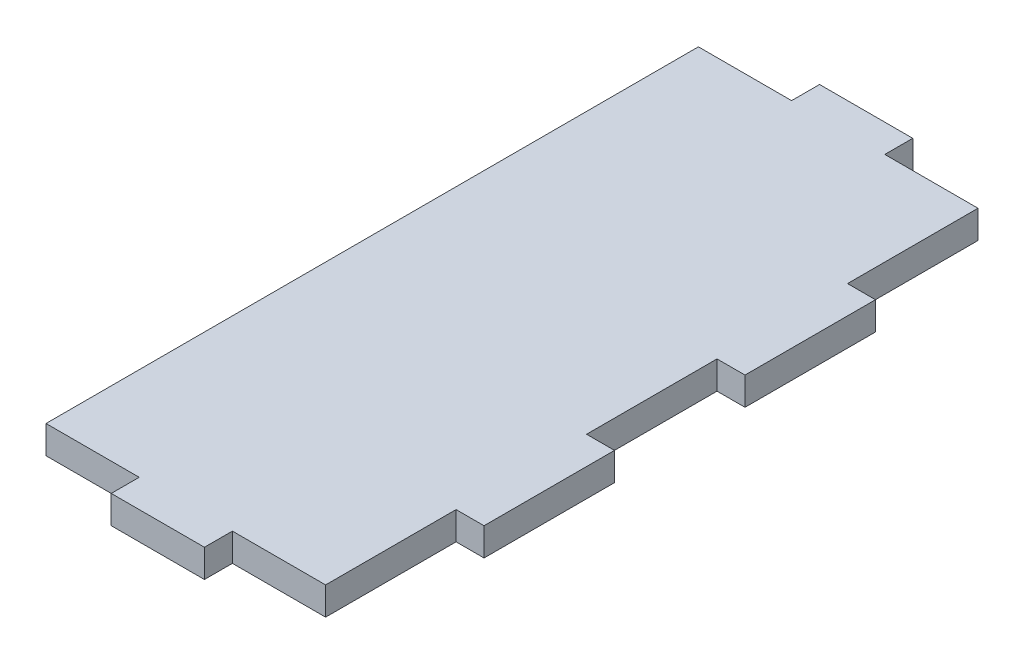
ISO-10303-21;
HEADER;
FILE_DESCRIPTION(('STEP AP214'),'2;1');
FILE_NAME('part.step','',(''),(''),'','','');
FILE_SCHEMA(('AUTOMOTIVE_DESIGN { 1 0 10303 214 1 1 1 1 }'));
ENDSEC;
DATA;
#1=APPLICATION_CONTEXT('core data for automotive mechanical design processes');
#2=APPLICATION_PROTOCOL_DEFINITION('international standard','automotive_design',2000,#1);
#3=PRODUCT_CONTEXT('',#1,'mechanical');
#4=PRODUCT('Part','Part','',(#3));
#5=PRODUCT_RELATED_PRODUCT_CATEGORY('part','',(#4));
#6=PRODUCT_DEFINITION_FORMATION('','',#4);
#7=PRODUCT_DEFINITION_CONTEXT('part definition',#1,'design');
#8=PRODUCT_DEFINITION('design','',#6,#7);
#9=PRODUCT_DEFINITION_SHAPE('','',#8);
#10=(LENGTH_UNIT() NAMED_UNIT(*) SI_UNIT(.MILLI.,.METRE.));
#11=(NAMED_UNIT(*) PLANE_ANGLE_UNIT() SI_UNIT($,.RADIAN.));
#12=(NAMED_UNIT(*) SI_UNIT($,.STERADIAN.) SOLID_ANGLE_UNIT());
#13=UNCERTAINTY_MEASURE_WITH_UNIT(LENGTH_MEASURE(1.E-05),#10,'distance_accuracy_value','');
#14=(GEOMETRIC_REPRESENTATION_CONTEXT(3) GLOBAL_UNCERTAINTY_ASSIGNED_CONTEXT((#13)) GLOBAL_UNIT_ASSIGNED_CONTEXT((#10,
#11,#12)) REPRESENTATION_CONTEXT('',''));
#15=CARTESIAN_POINT('',(0.,0.,0.));
#16=DIRECTION('',(0.,0.,1.));
#17=DIRECTION('',(1.,0.,0.));
#18=AXIS2_PLACEMENT_3D('',#15,#16,#17);
#19=CARTESIAN_POINT('',(0.,3.,70.));
#20=DIRECTION('',(1.,0.,0.));
#21=DIRECTION('',(0.,0.,-1.));
#22=AXIS2_PLACEMENT_3D('',#19,#20,#21);
#23=PLANE('',#22);
#24=DIRECTION('',(0.,0.,1.));
#25=VECTOR('',#24,1.);
#26=CARTESIAN_POINT('',(0.,0.,70.));
#27=LINE('',#26,#25);
#28=CARTESIAN_POINT('',(0.,0.,0.));
#29=VERTEX_POINT('',#28);
#30=CARTESIAN_POINT('',(0.,0.,70.));
#31=VERTEX_POINT('',#30);
#32=EDGE_CURVE('E201',#29,#31,#27,.T.);
#33=ORIENTED_EDGE('',*,*,#32,.T.);
#34=DIRECTION('',(0.,-1.,0.));
#35=VECTOR('',#34,1.);
#36=CARTESIAN_POINT('',(0.,3.,70.));
#37=LINE('',#36,#35);
#38=CARTESIAN_POINT('',(0.,3.,70.));
#39=VERTEX_POINT('',#38);
#40=EDGE_CURVE('E11',#39,#31,#37,.T.);
#41=ORIENTED_EDGE('',*,*,#40,.F.);
#42=DIRECTION('',(0.,0.,1.));
#43=VECTOR('',#42,1.);
#44=CARTESIAN_POINT('',(0.,3.,70.));
#45=LINE('',#44,#43);
#46=CARTESIAN_POINT('',(0.,3.,0.));
#47=VERTEX_POINT('',#46);
#48=EDGE_CURVE('E239',#47,#39,#45,.T.);
#49=ORIENTED_EDGE('',*,*,#48,.F.);
#50=DIRECTION('',(0.,-1.,0.));
#51=VECTOR('',#50,1.);
#52=CARTESIAN_POINT('',(0.,3.,0.));
#53=LINE('',#52,#51);
#54=EDGE_CURVE('E197',#47,#29,#53,.T.);
#55=ORIENTED_EDGE('',*,*,#54,.T.);
#56=EDGE_LOOP('',(#33,#41,#49,#55));
#57=FACE_BOUND('',#56,.T.);
#58=ADVANCED_FACE('F33',(#57),#23,.F.);
#59=CARTESIAN_POINT('',(10.,3.,70.));
#60=DIRECTION('',(0.,0.,-1.));
#61=DIRECTION('',(-1.,0.,0.));
#62=AXIS2_PLACEMENT_3D('',#59,#60,#61);
#63=PLANE('',#62);
#64=DIRECTION('',(1.,0.,0.));
#65=VECTOR('',#64,1.);
#66=CARTESIAN_POINT('',(10.,0.,70.));
#67=LINE('',#66,#65);
#68=CARTESIAN_POINT('',(10.,0.,70.));
#69=VERTEX_POINT('',#68);
#70=EDGE_CURVE('E204',#31,#69,#67,.T.);
#71=ORIENTED_EDGE('',*,*,#70,.T.);
#72=DIRECTION('',(0.,-1.,0.));
#73=VECTOR('',#72,1.);
#74=CARTESIAN_POINT('',(10.,3.,70.));
#75=LINE('',#74,#73);
#76=CARTESIAN_POINT('',(10.,3.,70.));
#77=VERTEX_POINT('',#76);
#78=EDGE_CURVE('E41',#77,#69,#75,.T.);
#79=ORIENTED_EDGE('',*,*,#78,.F.);
#80=DIRECTION('',(1.,0.,0.));
#81=VECTOR('',#80,1.);
#82=CARTESIAN_POINT('',(10.,3.,70.));
#83=LINE('',#82,#81);
#84=EDGE_CURVE('E128',#39,#77,#83,.T.);
#85=ORIENTED_EDGE('',*,*,#84,.F.);
#86=ORIENTED_EDGE('',*,*,#40,.T.);
#87=EDGE_LOOP('',(#71,#79,#85,#86));
#88=FACE_BOUND('',#87,.T.);
#89=ADVANCED_FACE('F357',(#88),#63,.F.);
#90=CARTESIAN_POINT('',(10.,3.,73.));
#91=DIRECTION('',(1.,0.,0.));
#92=DIRECTION('',(0.,0.,-1.));
#93=AXIS2_PLACEMENT_3D('',#90,#91,#92);
#94=PLANE('',#93);
#95=DIRECTION('',(0.,0.,1.));
#96=VECTOR('',#95,1.);
#97=CARTESIAN_POINT('',(10.,0.,73.));
#98=LINE('',#97,#96);
#99=CARTESIAN_POINT('',(10.,0.,73.));
#100=VERTEX_POINT('',#99);
#101=EDGE_CURVE('E206',#69,#100,#98,.T.);
#102=ORIENTED_EDGE('',*,*,#101,.T.);
#103=DIRECTION('',(0.,-1.,0.));
#104=VECTOR('',#103,1.);
#105=CARTESIAN_POINT('',(10.,3.,73.));
#106=LINE('',#105,#104);
#107=CARTESIAN_POINT('',(10.,3.,73.));
#108=VERTEX_POINT('',#107);
#109=EDGE_CURVE('E282',#108,#100,#106,.T.);
#110=ORIENTED_EDGE('',*,*,#109,.F.);
#111=DIRECTION('',(0.,0.,1.));
#112=VECTOR('',#111,1.);
#113=CARTESIAN_POINT('',(10.,3.,73.));
#114=LINE('',#113,#112);
#115=EDGE_CURVE('E290',#77,#108,#114,.T.);
#116=ORIENTED_EDGE('',*,*,#115,.F.);
#117=ORIENTED_EDGE('',*,*,#78,.T.);
#118=EDGE_LOOP('',(#102,#110,#116,#117));
#119=FACE_BOUND('',#118,.T.);
#120=ADVANCED_FACE('F288',(#119),#94,.F.);
#121=CARTESIAN_POINT('',(20.,3.,73.));
#122=DIRECTION('',(0.,0.,-1.));
#123=DIRECTION('',(-1.,0.,0.));
#124=AXIS2_PLACEMENT_3D('',#121,#122,#123);
#125=PLANE('',#124);
#126=DIRECTION('',(1.,0.,0.));
#127=VECTOR('',#126,1.);
#128=CARTESIAN_POINT('',(20.,0.,73.));
#129=LINE('',#128,#127);
#130=CARTESIAN_POINT('',(20.,0.,73.));
#131=VERTEX_POINT('',#130);
#132=EDGE_CURVE('E208',#100,#131,#129,.T.);
#133=ORIENTED_EDGE('',*,*,#132,.T.);
#134=DIRECTION('',(0.,-1.,0.));
#135=VECTOR('',#134,1.);
#136=CARTESIAN_POINT('',(20.,3.,73.));
#137=LINE('',#136,#135);
#138=CARTESIAN_POINT('',(20.,3.,73.));
#139=VERTEX_POINT('',#138);
#140=EDGE_CURVE('E279',#139,#131,#137,.T.);
#141=ORIENTED_EDGE('',*,*,#140,.F.);
#142=DIRECTION('',(1.,0.,0.));
#143=VECTOR('',#142,1.);
#144=CARTESIAN_POINT('',(20.,3.,73.));
#145=LINE('',#144,#143);
#146=EDGE_CURVE('E308',#108,#139,#145,.T.);
#147=ORIENTED_EDGE('',*,*,#146,.F.);
#148=ORIENTED_EDGE('',*,*,#109,.T.);
#149=EDGE_LOOP('',(#133,#141,#147,#148));
#150=FACE_BOUND('',#149,.T.);
#151=ADVANCED_FACE('F299',(#150),#125,.F.);
#152=CARTESIAN_POINT('',(20.,3.,70.));
#153=DIRECTION('',(-1.,0.,0.));
#154=DIRECTION('',(0.,0.,1.));
#155=AXIS2_PLACEMENT_3D('',#152,#153,#154);
#156=PLANE('',#155);
#157=DIRECTION('',(0.,0.,-1.));
#158=VECTOR('',#157,1.);
#159=CARTESIAN_POINT('',(20.,0.,70.));
#160=LINE('',#159,#158);
#161=CARTESIAN_POINT('',(20.,0.,70.));
#162=VERTEX_POINT('',#161);
#163=EDGE_CURVE('E210',#131,#162,#160,.T.);
#164=ORIENTED_EDGE('',*,*,#163,.T.);
#165=DIRECTION('',(0.,-1.,0.));
#166=VECTOR('',#165,1.);
#167=CARTESIAN_POINT('',(20.,3.,70.));
#168=LINE('',#167,#166);
#169=CARTESIAN_POINT('',(20.,3.,70.));
#170=VERTEX_POINT('',#169);
#171=EDGE_CURVE('E276',#170,#162,#168,.T.);
#172=ORIENTED_EDGE('',*,*,#171,.F.);
#173=DIRECTION('',(0.,0.,-1.));
#174=VECTOR('',#173,1.);
#175=CARTESIAN_POINT('',(20.,3.,70.));
#176=LINE('',#175,#174);
#177=EDGE_CURVE('E305',#139,#170,#176,.T.);
#178=ORIENTED_EDGE('',*,*,#177,.F.);
#179=ORIENTED_EDGE('',*,*,#140,.T.);
#180=EDGE_LOOP('',(#164,#172,#178,#179));
#181=FACE_BOUND('',#180,.T.);
#182=ADVANCED_FACE('F303',(#181),#156,.F.);
#183=CARTESIAN_POINT('',(30.,3.,70.));
#184=DIRECTION('',(0.,0.,-1.));
#185=DIRECTION('',(-1.,0.,0.));
#186=AXIS2_PLACEMENT_3D('',#183,#184,#185);
#187=PLANE('',#186);
#188=DIRECTION('',(1.,0.,0.));
#189=VECTOR('',#188,1.);
#190=CARTESIAN_POINT('',(30.,0.,70.));
#191=LINE('',#190,#189);
#192=CARTESIAN_POINT('',(30.,0.,70.));
#193=VERTEX_POINT('',#192);
#194=EDGE_CURVE('E212',#162,#193,#191,.T.);
#195=ORIENTED_EDGE('',*,*,#194,.T.);
#196=DIRECTION('',(0.,-1.,0.));
#197=VECTOR('',#196,1.);
#198=CARTESIAN_POINT('',(30.,3.,70.));
#199=LINE('',#198,#197);
#200=CARTESIAN_POINT('',(30.,3.,70.));
#201=VERTEX_POINT('',#200);
#202=EDGE_CURVE('E273',#201,#193,#199,.T.);
#203=ORIENTED_EDGE('',*,*,#202,.F.);
#204=DIRECTION('',(1.,0.,0.));
#205=VECTOR('',#204,1.);
#206=CARTESIAN_POINT('',(30.,3.,70.));
#207=LINE('',#206,#205);
#208=EDGE_CURVE('E307',#170,#201,#207,.T.);
#209=ORIENTED_EDGE('',*,*,#208,.F.);
#210=ORIENTED_EDGE('',*,*,#171,.T.);
#211=EDGE_LOOP('',(#195,#203,#209,#210));
#212=FACE_BOUND('',#211,.T.);
#213=ADVANCED_FACE('F370',(#212),#187,.F.);
#214=CARTESIAN_POINT('',(30.,3.,70.));
#215=DIRECTION('',(-1.,0.,0.));
#216=DIRECTION('',(0.,0.,1.));
#217=AXIS2_PLACEMENT_3D('',#214,#215,#216);
#218=PLANE('',#217);
#219=DIRECTION('',(0.,0.,-1.));
#220=VECTOR('',#219,1.);
#221=CARTESIAN_POINT('',(30.,0.,70.));
#222=LINE('',#221,#220);
#223=CARTESIAN_POINT('',(30.,0.,56.));
#224=VERTEX_POINT('',#223);
#225=EDGE_CURVE('E214',#193,#224,#222,.T.);
#226=ORIENTED_EDGE('',*,*,#225,.T.);
#227=DIRECTION('',(0.,-1.,0.));
#228=VECTOR('',#227,1.);
#229=CARTESIAN_POINT('',(30.,3.,56.));
#230=LINE('',#229,#228);
#231=CARTESIAN_POINT('',(30.,3.,56.));
#232=VERTEX_POINT('',#231);
#233=EDGE_CURVE('E270',#232,#224,#230,.T.);
#234=ORIENTED_EDGE('',*,*,#233,.F.);
#235=DIRECTION('',(0.,0.,-1.));
#236=VECTOR('',#235,1.);
#237=CARTESIAN_POINT('',(30.,3.,70.));
#238=LINE('',#237,#236);
#239=EDGE_CURVE('E310',#201,#232,#238,.T.);
#240=ORIENTED_EDGE('',*,*,#239,.F.);
#241=ORIENTED_EDGE('',*,*,#202,.T.);
#242=EDGE_LOOP('',(#226,#234,#240,#241));
#243=FACE_BOUND('',#242,.T.);
#244=ADVANCED_FACE('F373',(#243),#218,.F.);
#245=CARTESIAN_POINT('',(30.,3.,56.));
#246=DIRECTION('',(0.,0.,-1.));
#247=DIRECTION('',(-1.,0.,0.));
#248=AXIS2_PLACEMENT_3D('',#245,#246,#247);
#249=PLANE('',#248);
#250=DIRECTION('',(1.,0.,0.));
#251=VECTOR('',#250,1.);
#252=CARTESIAN_POINT('',(30.,0.,56.));
#253=LINE('',#252,#251);
#254=CARTESIAN_POINT('',(33.,0.,56.));
#255=VERTEX_POINT('',#254);
#256=EDGE_CURVE('E216',#224,#255,#253,.T.);
#257=ORIENTED_EDGE('',*,*,#256,.T.);
#258=DIRECTION('',(0.,-1.,0.));
#259=VECTOR('',#258,1.);
#260=CARTESIAN_POINT('',(33.,3.,56.));
#261=LINE('',#260,#259);
#262=CARTESIAN_POINT('',(33.,3.,56.));
#263=VERTEX_POINT('',#262);
#264=EDGE_CURVE('E267',#263,#255,#261,.T.);
#265=ORIENTED_EDGE('',*,*,#264,.F.);
#266=DIRECTION('',(1.,0.,0.));
#267=VECTOR('',#266,1.);
#268=CARTESIAN_POINT('',(30.,3.,56.));
#269=LINE('',#268,#267);
#270=EDGE_CURVE('E316',#232,#263,#269,.T.);
#271=ORIENTED_EDGE('',*,*,#270,.F.);
#272=ORIENTED_EDGE('',*,*,#233,.T.);
#273=EDGE_LOOP('',(#257,#265,#271,#272));
#274=FACE_BOUND('',#273,.T.);
#275=ADVANCED_FACE('F377',(#274),#249,.F.);
#276=CARTESIAN_POINT('',(33.,3.,56.));
#277=DIRECTION('',(-1.,0.,0.));
#278=DIRECTION('',(0.,0.,1.));
#279=AXIS2_PLACEMENT_3D('',#276,#277,#278);
#280=PLANE('',#279);
#281=DIRECTION('',(0.,0.,-1.));
#282=VECTOR('',#281,1.);
#283=CARTESIAN_POINT('',(33.,0.,56.));
#284=LINE('',#283,#282);
#285=CARTESIAN_POINT('',(33.,0.,42.));
#286=VERTEX_POINT('',#285);
#287=EDGE_CURVE('E218',#255,#286,#284,.T.);
#288=ORIENTED_EDGE('',*,*,#287,.T.);
#289=DIRECTION('',(0.,-1.,0.));
#290=VECTOR('',#289,1.);
#291=CARTESIAN_POINT('',(33.,3.,42.));
#292=LINE('',#291,#290);
#293=CARTESIAN_POINT('',(33.,3.,42.));
#294=VERTEX_POINT('',#293);
#295=EDGE_CURVE('E264',#294,#286,#292,.T.);
#296=ORIENTED_EDGE('',*,*,#295,.F.);
#297=DIRECTION('',(0.,0.,-1.));
#298=VECTOR('',#297,1.);
#299=CARTESIAN_POINT('',(33.,3.,56.));
#300=LINE('',#299,#298);
#301=EDGE_CURVE('E318',#263,#294,#300,.T.);
#302=ORIENTED_EDGE('',*,*,#301,.F.);
#303=ORIENTED_EDGE('',*,*,#264,.T.);
#304=EDGE_LOOP('',(#288,#296,#302,#303));
#305=FACE_BOUND('',#304,.T.);
#306=ADVANCED_FACE('F381',(#305),#280,.F.);
#307=CARTESIAN_POINT('',(33.,3.,42.));
#308=DIRECTION('',(0.,0.,1.));
#309=DIRECTION('',(1.,0.,0.));
#310=AXIS2_PLACEMENT_3D('',#307,#308,#309);
#311=PLANE('',#310);
#312=DIRECTION('',(-1.,0.,0.));
#313=VECTOR('',#312,1.);
#314=CARTESIAN_POINT('',(33.,0.,42.));
#315=LINE('',#314,#313);
#316=CARTESIAN_POINT('',(30.,0.,42.));
#317=VERTEX_POINT('',#316);
#318=EDGE_CURVE('E220',#286,#317,#315,.T.);
#319=ORIENTED_EDGE('',*,*,#318,.T.);
#320=DIRECTION('',(0.,-1.,0.));
#321=VECTOR('',#320,1.);
#322=CARTESIAN_POINT('',(30.,3.,42.));
#323=LINE('',#322,#321);
#324=CARTESIAN_POINT('',(30.,3.,42.));
#325=VERTEX_POINT('',#324);
#326=EDGE_CURVE('E261',#325,#317,#323,.T.);
#327=ORIENTED_EDGE('',*,*,#326,.F.);
#328=DIRECTION('',(-1.,0.,0.));
#329=VECTOR('',#328,1.);
#330=CARTESIAN_POINT('',(33.,3.,42.));
#331=LINE('',#330,#329);
#332=EDGE_CURVE('E320',#294,#325,#331,.T.);
#333=ORIENTED_EDGE('',*,*,#332,.F.);
#334=ORIENTED_EDGE('',*,*,#295,.T.);
#335=EDGE_LOOP('',(#319,#327,#333,#334));
#336=FACE_BOUND('',#335,.T.);
#337=ADVANCED_FACE('F385',(#336),#311,.F.);
#338=CARTESIAN_POINT('',(30.,3.,42.));
#339=DIRECTION('',(-1.,0.,0.));
#340=DIRECTION('',(0.,0.,1.));
#341=AXIS2_PLACEMENT_3D('',#338,#339,#340);
#342=PLANE('',#341);
#343=DIRECTION('',(0.,0.,-1.));
#344=VECTOR('',#343,1.);
#345=CARTESIAN_POINT('',(30.,0.,42.));
#346=LINE('',#345,#344);
#347=CARTESIAN_POINT('',(30.,0.,28.));
#348=VERTEX_POINT('',#347);
#349=EDGE_CURVE('E222',#317,#348,#346,.T.);
#350=ORIENTED_EDGE('',*,*,#349,.T.);
#351=DIRECTION('',(0.,-1.,0.));
#352=VECTOR('',#351,1.);
#353=CARTESIAN_POINT('',(30.,3.,28.));
#354=LINE('',#353,#352);
#355=CARTESIAN_POINT('',(30.,3.,28.));
#356=VERTEX_POINT('',#355);
#357=EDGE_CURVE('E258',#356,#348,#354,.T.);
#358=ORIENTED_EDGE('',*,*,#357,.F.);
#359=DIRECTION('',(0.,0.,-1.));
#360=VECTOR('',#359,1.);
#361=CARTESIAN_POINT('',(30.,3.,42.));
#362=LINE('',#361,#360);
#363=EDGE_CURVE('E322',#325,#356,#362,.T.);
#364=ORIENTED_EDGE('',*,*,#363,.F.);
#365=ORIENTED_EDGE('',*,*,#326,.T.);
#366=EDGE_LOOP('',(#350,#358,#364,#365));
#367=FACE_BOUND('',#366,.T.);
#368=ADVANCED_FACE('F389',(#367),#342,.F.);
#369=CARTESIAN_POINT('',(30.,3.,28.));
#370=DIRECTION('',(0.,0.,-1.));
#371=DIRECTION('',(-1.,0.,0.));
#372=AXIS2_PLACEMENT_3D('',#369,#370,#371);
#373=PLANE('',#372);
#374=DIRECTION('',(1.,0.,0.));
#375=VECTOR('',#374,1.);
#376=CARTESIAN_POINT('',(30.,0.,28.));
#377=LINE('',#376,#375);
#378=CARTESIAN_POINT('',(33.,0.,28.));
#379=VERTEX_POINT('',#378);
#380=EDGE_CURVE('E224',#348,#379,#377,.T.);
#381=ORIENTED_EDGE('',*,*,#380,.T.);
#382=DIRECTION('',(0.,-1.,0.));
#383=VECTOR('',#382,1.);
#384=CARTESIAN_POINT('',(33.,3.,28.));
#385=LINE('',#384,#383);
#386=CARTESIAN_POINT('',(33.,3.,28.));
#387=VERTEX_POINT('',#386);
#388=EDGE_CURVE('E255',#387,#379,#385,.T.);
#389=ORIENTED_EDGE('',*,*,#388,.F.);
#390=DIRECTION('',(1.,0.,0.));
#391=VECTOR('',#390,1.);
#392=CARTESIAN_POINT('',(30.,3.,28.));
#393=LINE('',#392,#391);
#394=EDGE_CURVE('E324',#356,#387,#393,.T.);
#395=ORIENTED_EDGE('',*,*,#394,.F.);
#396=ORIENTED_EDGE('',*,*,#357,.T.);
#397=EDGE_LOOP('',(#381,#389,#395,#396));
#398=FACE_BOUND('',#397,.T.);
#399=ADVANCED_FACE('F393',(#398),#373,.F.);
#400=CARTESIAN_POINT('',(33.,3.,28.));
#401=DIRECTION('',(-1.,0.,0.));
#402=DIRECTION('',(0.,0.,1.));
#403=AXIS2_PLACEMENT_3D('',#400,#401,#402);
#404=PLANE('',#403);
#405=DIRECTION('',(0.,0.,-1.));
#406=VECTOR('',#405,1.);
#407=CARTESIAN_POINT('',(33.,0.,28.));
#408=LINE('',#407,#406);
#409=CARTESIAN_POINT('',(33.,0.,14.));
#410=VERTEX_POINT('',#409);
#411=EDGE_CURVE('E226',#379,#410,#408,.T.);
#412=ORIENTED_EDGE('',*,*,#411,.T.);
#413=DIRECTION('',(0.,-1.,0.));
#414=VECTOR('',#413,1.);
#415=CARTESIAN_POINT('',(33.,3.,14.));
#416=LINE('',#415,#414);
#417=CARTESIAN_POINT('',(33.,3.,14.));
#418=VERTEX_POINT('',#417);
#419=EDGE_CURVE('E252',#418,#410,#416,.T.);
#420=ORIENTED_EDGE('',*,*,#419,.F.);
#421=DIRECTION('',(0.,0.,-1.));
#422=VECTOR('',#421,1.);
#423=CARTESIAN_POINT('',(33.,3.,28.));
#424=LINE('',#423,#422);
#425=EDGE_CURVE('E326',#387,#418,#424,.T.);
#426=ORIENTED_EDGE('',*,*,#425,.F.);
#427=ORIENTED_EDGE('',*,*,#388,.T.);
#428=EDGE_LOOP('',(#412,#420,#426,#427));
#429=FACE_BOUND('',#428,.T.);
#430=ADVANCED_FACE('F397',(#429),#404,.F.);
#431=CARTESIAN_POINT('',(33.,3.,14.));
#432=DIRECTION('',(0.,0.,1.));
#433=DIRECTION('',(1.,0.,0.));
#434=AXIS2_PLACEMENT_3D('',#431,#432,#433);
#435=PLANE('',#434);
#436=DIRECTION('',(-1.,0.,0.));
#437=VECTOR('',#436,1.);
#438=CARTESIAN_POINT('',(33.,0.,14.));
#439=LINE('',#438,#437);
#440=CARTESIAN_POINT('',(30.,0.,14.));
#441=VERTEX_POINT('',#440);
#442=EDGE_CURVE('E228',#410,#441,#439,.T.);
#443=ORIENTED_EDGE('',*,*,#442,.T.);
#444=DIRECTION('',(0.,-1.,0.));
#445=VECTOR('',#444,1.);
#446=CARTESIAN_POINT('',(30.,3.,14.));
#447=LINE('',#446,#445);
#448=CARTESIAN_POINT('',(30.,3.,14.));
#449=VERTEX_POINT('',#448);
#450=EDGE_CURVE('E249',#449,#441,#447,.T.);
#451=ORIENTED_EDGE('',*,*,#450,.F.);
#452=DIRECTION('',(-1.,0.,0.));
#453=VECTOR('',#452,1.);
#454=CARTESIAN_POINT('',(33.,3.,14.));
#455=LINE('',#454,#453);
#456=EDGE_CURVE('E328',#418,#449,#455,.T.);
#457=ORIENTED_EDGE('',*,*,#456,.F.);
#458=ORIENTED_EDGE('',*,*,#419,.T.);
#459=EDGE_LOOP('',(#443,#451,#457,#458));
#460=FACE_BOUND('',#459,.T.);
#461=ADVANCED_FACE('F401',(#460),#435,.F.);
#462=CARTESIAN_POINT('',(30.,3.,14.));
#463=DIRECTION('',(-1.,0.,0.));
#464=DIRECTION('',(0.,0.,1.));
#465=AXIS2_PLACEMENT_3D('',#462,#463,#464);
#466=PLANE('',#465);
#467=DIRECTION('',(0.,0.,-1.));
#468=VECTOR('',#467,1.);
#469=CARTESIAN_POINT('',(30.,0.,14.));
#470=LINE('',#469,#468);
#471=CARTESIAN_POINT('',(30.,0.,0.));
#472=VERTEX_POINT('',#471);
#473=EDGE_CURVE('E230',#441,#472,#470,.T.);
#474=ORIENTED_EDGE('',*,*,#473,.T.);
#475=DIRECTION('',(0.,-1.,0.));
#476=VECTOR('',#475,1.);
#477=CARTESIAN_POINT('',(30.,3.,0.));
#478=LINE('',#477,#476);
#479=CARTESIAN_POINT('',(30.,3.,0.));
#480=VERTEX_POINT('',#479);
#481=EDGE_CURVE('E246',#480,#472,#478,.T.);
#482=ORIENTED_EDGE('',*,*,#481,.F.);
#483=DIRECTION('',(0.,0.,-1.));
#484=VECTOR('',#483,1.);
#485=CARTESIAN_POINT('',(30.,3.,14.));
#486=LINE('',#485,#484);
#487=EDGE_CURVE('E330',#449,#480,#486,.T.);
#488=ORIENTED_EDGE('',*,*,#487,.F.);
#489=ORIENTED_EDGE('',*,*,#450,.T.);
#490=EDGE_LOOP('',(#474,#482,#488,#489));
#491=FACE_BOUND('',#490,.T.);
#492=ADVANCED_FACE('F405',(#491),#466,.F.);
#493=CARTESIAN_POINT('',(20.,3.,0.));
#494=DIRECTION('',(0.,0.,1.));
#495=DIRECTION('',(1.,0.,0.));
#496=AXIS2_PLACEMENT_3D('',#493,#494,#495);
#497=PLANE('',#496);
#498=DIRECTION('',(-1.,0.,0.));
#499=VECTOR('',#498,1.);
#500=CARTESIAN_POINT('',(20.,0.,0.));
#501=LINE('',#500,#499);
#502=CARTESIAN_POINT('',(20.,0.,0.));
#503=VERTEX_POINT('',#502);
#504=EDGE_CURVE('E232',#472,#503,#501,.T.);
#505=ORIENTED_EDGE('',*,*,#504,.T.);
#506=DIRECTION('',(0.,-1.,0.));
#507=VECTOR('',#506,1.);
#508=CARTESIAN_POINT('',(20.,3.,0.));
#509=LINE('',#508,#507);
#510=CARTESIAN_POINT('',(20.,3.,0.));
#511=VERTEX_POINT('',#510);
#512=EDGE_CURVE('E243',#511,#503,#509,.T.);
#513=ORIENTED_EDGE('',*,*,#512,.F.);
#514=DIRECTION('',(-1.,0.,0.));
#515=VECTOR('',#514,1.);
#516=CARTESIAN_POINT('',(20.,3.,0.));
#517=LINE('',#516,#515);
#518=EDGE_CURVE('E332',#480,#511,#517,.T.);
#519=ORIENTED_EDGE('',*,*,#518,.F.);
#520=ORIENTED_EDGE('',*,*,#481,.T.);
#521=EDGE_LOOP('',(#505,#513,#519,#520));
#522=FACE_BOUND('',#521,.T.);
#523=ADVANCED_FACE('F338',(#522),#497,.F.);
#524=CARTESIAN_POINT('',(20.,3.,-3.));
#525=DIRECTION('',(-1.,0.,0.));
#526=DIRECTION('',(0.,0.,1.));
#527=AXIS2_PLACEMENT_3D('',#524,#525,#526);
#528=PLANE('',#527);
#529=DIRECTION('',(0.,0.,-1.));
#530=VECTOR('',#529,1.);
#531=CARTESIAN_POINT('',(20.,0.,-3.));
#532=LINE('',#531,#530);
#533=CARTESIAN_POINT('',(20.,0.,-3.));
#534=VERTEX_POINT('',#533);
#535=EDGE_CURVE('E234',#503,#534,#532,.T.);
#536=ORIENTED_EDGE('',*,*,#535,.T.);
#537=DIRECTION('',(0.,-1.,0.));
#538=VECTOR('',#537,1.);
#539=CARTESIAN_POINT('',(20.,3.,-3.));
#540=LINE('',#539,#538);
#541=CARTESIAN_POINT('',(20.,3.,-3.));
#542=VERTEX_POINT('',#541);
#543=EDGE_CURVE('E192',#542,#534,#540,.T.);
#544=ORIENTED_EDGE('',*,*,#543,.F.);
#545=DIRECTION('',(0.,0.,-1.));
#546=VECTOR('',#545,1.);
#547=CARTESIAN_POINT('',(20.,3.,-3.));
#548=LINE('',#547,#546);
#549=EDGE_CURVE('E183',#511,#542,#548,.T.);
#550=ORIENTED_EDGE('',*,*,#549,.F.);
#551=ORIENTED_EDGE('',*,*,#512,.T.);
#552=EDGE_LOOP('',(#536,#544,#550,#551));
#553=FACE_BOUND('',#552,.T.);
#554=ADVANCED_FACE('F342',(#553),#528,.F.);
#555=CARTESIAN_POINT('',(10.,3.,-3.));
#556=DIRECTION('',(0.,0.,1.));
#557=DIRECTION('',(1.,0.,0.));
#558=AXIS2_PLACEMENT_3D('',#555,#556,#557);
#559=PLANE('',#558);
#560=DIRECTION('',(-1.,0.,0.));
#561=VECTOR('',#560,1.);
#562=CARTESIAN_POINT('',(10.,0.,-3.));
#563=LINE('',#562,#561);
#564=CARTESIAN_POINT('',(10.,0.,-3.));
#565=VERTEX_POINT('',#564);
#566=EDGE_CURVE('E191',#534,#565,#563,.T.);
#567=ORIENTED_EDGE('',*,*,#566,.T.);
#568=DIRECTION('',(0.,-1.,0.));
#569=VECTOR('',#568,1.);
#570=CARTESIAN_POINT('',(10.,3.,-3.));
#571=LINE('',#570,#569);
#572=CARTESIAN_POINT('',(10.,3.,-3.));
#573=VERTEX_POINT('',#572);
#574=EDGE_CURVE('E188',#573,#565,#571,.T.);
#575=ORIENTED_EDGE('',*,*,#574,.F.);
#576=DIRECTION('',(-1.,0.,0.));
#577=VECTOR('',#576,1.);
#578=CARTESIAN_POINT('',(10.,3.,-3.));
#579=LINE('',#578,#577);
#580=EDGE_CURVE('E177',#542,#573,#579,.T.);
#581=ORIENTED_EDGE('',*,*,#580,.F.);
#582=ORIENTED_EDGE('',*,*,#543,.T.);
#583=EDGE_LOOP('',(#567,#575,#581,#582));
#584=FACE_BOUND('',#583,.T.);
#585=ADVANCED_FACE('F189',(#584),#559,.F.);
#586=CARTESIAN_POINT('',(10.,3.,0.));
#587=DIRECTION('',(1.,0.,0.));
#588=DIRECTION('',(0.,0.,-1.));
#589=AXIS2_PLACEMENT_3D('',#586,#587,#588);
#590=PLANE('',#589);
#591=DIRECTION('',(0.,0.,1.));
#592=VECTOR('',#591,1.);
#593=CARTESIAN_POINT('',(10.,0.,0.));
#594=LINE('',#593,#592);
#595=CARTESIAN_POINT('',(10.,0.,0.));
#596=VERTEX_POINT('',#595);
#597=EDGE_CURVE('E114',#565,#596,#594,.T.);
#598=ORIENTED_EDGE('',*,*,#597,.T.);
#599=DIRECTION('',(0.,-1.,0.));
#600=VECTOR('',#599,1.);
#601=CARTESIAN_POINT('',(10.,3.,0.));
#602=LINE('',#601,#600);
#603=CARTESIAN_POINT('',(10.,3.,0.));
#604=VERTEX_POINT('',#603);
#605=EDGE_CURVE('E193',#604,#596,#602,.T.);
#606=ORIENTED_EDGE('',*,*,#605,.F.);
#607=DIRECTION('',(0.,0.,1.));
#608=VECTOR('',#607,1.);
#609=CARTESIAN_POINT('',(10.,3.,0.));
#610=LINE('',#609,#608);
#611=EDGE_CURVE('E181',#573,#604,#610,.T.);
#612=ORIENTED_EDGE('',*,*,#611,.F.);
#613=ORIENTED_EDGE('',*,*,#574,.T.);
#614=EDGE_LOOP('',(#598,#606,#612,#613));
#615=FACE_BOUND('',#614,.T.);
#616=ADVANCED_FACE('F195',(#615),#590,.F.);
#617=CARTESIAN_POINT('',(0.,3.,0.));
#618=DIRECTION('',(0.,0.,1.));
#619=DIRECTION('',(1.,0.,0.));
#620=AXIS2_PLACEMENT_3D('',#617,#618,#619);
#621=PLANE('',#620);
#622=DIRECTION('',(-1.,0.,0.));
#623=VECTOR('',#622,1.);
#624=CARTESIAN_POINT('',(0.,0.,0.));
#625=LINE('',#624,#623);
#626=EDGE_CURVE('E120',#596,#29,#625,.T.);
#627=ORIENTED_EDGE('',*,*,#626,.T.);
#628=ORIENTED_EDGE('',*,*,#54,.F.);
#629=DIRECTION('',(-1.,0.,0.));
#630=VECTOR('',#629,1.);
#631=CARTESIAN_POINT('',(0.,3.,0.));
#632=LINE('',#631,#630);
#633=EDGE_CURVE('E49',#604,#47,#632,.T.);
#634=ORIENTED_EDGE('',*,*,#633,.F.);
#635=ORIENTED_EDGE('',*,*,#605,.T.);
#636=EDGE_LOOP('',(#627,#628,#634,#635));
#637=FACE_BOUND('',#636,.T.);
#638=ADVANCED_FACE('F346',(#637),#621,.F.);
#639=CARTESIAN_POINT('',(0.,3.,0.));
#640=DIRECTION('',(0.,-1.,0.));
#641=DIRECTION('',(0.,0.,-1.));
#642=AXIS2_PLACEMENT_3D('',#639,#640,#641);
#643=PLANE('',#642);
#644=ORIENTED_EDGE('',*,*,#48,.T.);
#645=ORIENTED_EDGE('',*,*,#84,.T.);
#646=ORIENTED_EDGE('',*,*,#115,.T.);
#647=ORIENTED_EDGE('',*,*,#146,.T.);
#648=ORIENTED_EDGE('',*,*,#177,.T.);
#649=ORIENTED_EDGE('',*,*,#208,.T.);
#650=ORIENTED_EDGE('',*,*,#239,.T.);
#651=ORIENTED_EDGE('',*,*,#270,.T.);
#652=ORIENTED_EDGE('',*,*,#301,.T.);
#653=ORIENTED_EDGE('',*,*,#332,.T.);
#654=ORIENTED_EDGE('',*,*,#363,.T.);
#655=ORIENTED_EDGE('',*,*,#394,.T.);
#656=ORIENTED_EDGE('',*,*,#425,.T.);
#657=ORIENTED_EDGE('',*,*,#456,.T.);
#658=ORIENTED_EDGE('',*,*,#487,.T.);
#659=ORIENTED_EDGE('',*,*,#518,.T.);
#660=ORIENTED_EDGE('',*,*,#549,.T.);
#661=ORIENTED_EDGE('',*,*,#580,.T.);
#662=ORIENTED_EDGE('',*,*,#611,.T.);
#663=ORIENTED_EDGE('',*,*,#633,.T.);
#664=EDGE_LOOP('',(#644,#645,#646,#647,#648,#649,#650,#651,#652,#653,#654,#655,#656,#657,#658,
#659,#660,#661,#662,#663));
#665=FACE_BOUND('',#664,.T.);
#666=ADVANCED_FACE('F179',(#665),#643,.F.);
#667=CARTESIAN_POINT('',(0.,0.,0.));
#668=DIRECTION('',(0.,-1.,0.));
#669=DIRECTION('',(0.,0.,-1.));
#670=AXIS2_PLACEMENT_3D('',#667,#668,#669);
#671=PLANE('',#670);
#672=ORIENTED_EDGE('',*,*,#32,.F.);
#673=ORIENTED_EDGE('',*,*,#626,.F.);
#674=ORIENTED_EDGE('',*,*,#597,.F.);
#675=ORIENTED_EDGE('',*,*,#566,.F.);
#676=ORIENTED_EDGE('',*,*,#535,.F.);
#677=ORIENTED_EDGE('',*,*,#504,.F.);
#678=ORIENTED_EDGE('',*,*,#473,.F.);
#679=ORIENTED_EDGE('',*,*,#442,.F.);
#680=ORIENTED_EDGE('',*,*,#411,.F.);
#681=ORIENTED_EDGE('',*,*,#380,.F.);
#682=ORIENTED_EDGE('',*,*,#349,.F.);
#683=ORIENTED_EDGE('',*,*,#318,.F.);
#684=ORIENTED_EDGE('',*,*,#287,.F.);
#685=ORIENTED_EDGE('',*,*,#256,.F.);
#686=ORIENTED_EDGE('',*,*,#225,.F.);
#687=ORIENTED_EDGE('',*,*,#194,.F.);
#688=ORIENTED_EDGE('',*,*,#163,.F.);
#689=ORIENTED_EDGE('',*,*,#132,.F.);
#690=ORIENTED_EDGE('',*,*,#101,.F.);
#691=ORIENTED_EDGE('',*,*,#70,.F.);
#692=EDGE_LOOP('',(#672,#673,#674,#675,#676,#677,#678,#679,#680,#681,#682,#683,#684,#685,#686,
#687,#688,#689,#690,#691));
#693=FACE_BOUND('',#692,.T.);
#694=ADVANCED_FACE('F294',(#693),#671,.T.);
#695=CLOSED_SHELL('',(#58,#89,#120,#151,#182,#213,#244,#275,#306,#337,#368,#399,#430,#461,#492,
#523,#554,#585,#616,#638,#666,#694));
#696=MANIFOLD_SOLID_BREP('B2',#695);
#697=ADVANCED_BREP_SHAPE_REPRESENTATION('',(#18,#696),#14);
#698=SHAPE_DEFINITION_REPRESENTATION(#9,#697);
ENDSEC;
END-ISO-10303-21;
